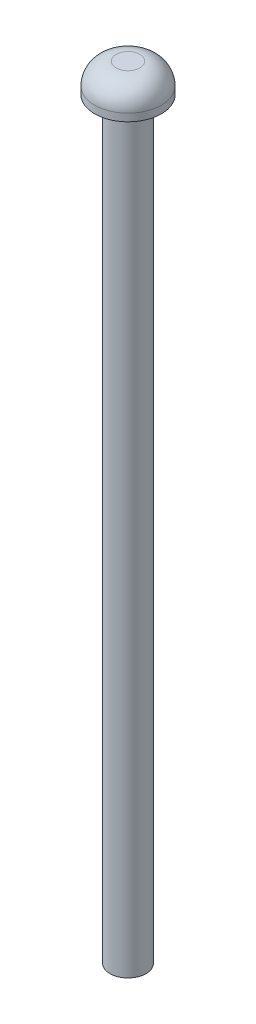
ISO-10303-21;
HEADER;
FILE_DESCRIPTION(('STEP AP214'),'2;1');
FILE_NAME('part.step','',(''),(''),'','','');
FILE_SCHEMA(('AUTOMOTIVE_DESIGN { 1 0 10303 214 1 1 1 1 }'));
ENDSEC;
DATA;
#1=APPLICATION_CONTEXT('core data for automotive mechanical design processes');
#2=APPLICATION_PROTOCOL_DEFINITION('international standard','automotive_design',2000,#1);
#3=PRODUCT_CONTEXT('',#1,'mechanical');
#4=PRODUCT('Part','Part','',(#3));
#5=PRODUCT_RELATED_PRODUCT_CATEGORY('part','',(#4));
#6=PRODUCT_DEFINITION_FORMATION('','',#4);
#7=PRODUCT_DEFINITION_CONTEXT('part definition',#1,'design');
#8=PRODUCT_DEFINITION('design','',#6,#7);
#9=PRODUCT_DEFINITION_SHAPE('','',#8);
#10=(LENGTH_UNIT() NAMED_UNIT(*) SI_UNIT(.MILLI.,.METRE.));
#11=(NAMED_UNIT(*) PLANE_ANGLE_UNIT() SI_UNIT($,.RADIAN.));
#12=(NAMED_UNIT(*) SI_UNIT($,.STERADIAN.) SOLID_ANGLE_UNIT());
#13=UNCERTAINTY_MEASURE_WITH_UNIT(LENGTH_MEASURE(1.E-05),#10,'distance_accuracy_value','');
#14=(GEOMETRIC_REPRESENTATION_CONTEXT(3) GLOBAL_UNCERTAINTY_ASSIGNED_CONTEXT((#13)) GLOBAL_UNIT_ASSIGNED_CONTEXT((#10,
#11,#12)) REPRESENTATION_CONTEXT('',''));
#15=CARTESIAN_POINT('',(0.,0.,0.));
#16=DIRECTION('',(0.,0.,1.));
#17=DIRECTION('',(1.,0.,0.));
#18=AXIS2_PLACEMENT_3D('',#15,#16,#17);
#19=CARTESIAN_POINT('',(0.,-70.,0.));
#20=DIRECTION('',(0.,1.,0.));
#21=DIRECTION('',(0.,0.,1.));
#22=AXIS2_PLACEMENT_3D('',#19,#20,#21);
#23=CYLINDRICAL_SURFACE('',#22,1.675);
#24=CARTESIAN_POINT('',(0.,-70.,0.));
#25=DIRECTION('',(0.,1.,0.));
#26=DIRECTION('',(0.,0.,1.));
#27=AXIS2_PLACEMENT_3D('',#24,#25,#26);
#28=CIRCLE('',#27,1.675);
#29=CARTESIAN_POINT('',(0.,-70.,1.675));
#30=VERTEX_POINT('',#29);
#31=EDGE_CURVE('E42',#30,#30,#28,.T.);
#32=ORIENTED_EDGE('',*,*,#31,.T.);
#33=EDGE_LOOP('',(#32));
#34=FACE_BOUND('',#33,.T.);
#35=CARTESIAN_POINT('',(0.,0.,0.));
#36=DIRECTION('',(0.,1.,0.));
#37=DIRECTION('',(0.,0.,1.));
#38=AXIS2_PLACEMENT_3D('',#35,#36,#37);
#39=CIRCLE('',#38,1.675);
#40=CARTESIAN_POINT('',(0.,0.,1.675));
#41=VERTEX_POINT('',#40);
#42=EDGE_CURVE('E46',#41,#41,#39,.T.);
#43=ORIENTED_EDGE('',*,*,#42,.F.);
#44=EDGE_LOOP('',(#43));
#45=FACE_BOUND('',#44,.T.);
#46=ADVANCED_FACE('F31',(#34,#45),#23,.T.);
#47=CARTESIAN_POINT('',(0.,-70.,0.));
#48=DIRECTION('',(0.,1.,0.));
#49=DIRECTION('',(0.,0.,1.));
#50=AXIS2_PLACEMENT_3D('',#47,#48,#49);
#51=PLANE('',#50);
#52=ORIENTED_EDGE('',*,*,#31,.F.);
#53=EDGE_LOOP('',(#52));
#54=FACE_BOUND('',#53,.T.);
#55=ADVANCED_FACE('F70',(#54),#51,.F.);
#56=CARTESIAN_POINT('',(0.,2.7,0.));
#57=DIRECTION('',(0.,-1.,0.));
#58=DIRECTION('',(0.,0.,-1.));
#59=AXIS2_PLACEMENT_3D('',#56,#57,#58);
#60=CYLINDRICAL_SURFACE('',#59,3.1);
#61=CARTESIAN_POINT('',(0.,0.699999999999998,0.));
#62=DIRECTION('',(0.,1.,0.));
#63=DIRECTION('',(0.,0.,1.));
#64=AXIS2_PLACEMENT_3D('',#61,#62,#63);
#65=CIRCLE('',#64,3.1);
#66=CARTESIAN_POINT('',(0.,0.699999999999998,-3.1));
#67=VERTEX_POINT('',#66);
#68=EDGE_CURVE('E10',#67,#67,#65,.F.);
#69=CARTESIAN_POINT('',(0.,0.,0.));
#70=DIRECTION('',(0.,1.,0.));
#71=DIRECTION('',(0.,0.,1.));
#72=AXIS2_PLACEMENT_3D('',#69,#70,#71);
#73=CIRCLE('',#72,3.1);
#74=CARTESIAN_POINT('',(0.,0.,-3.1));
#75=VERTEX_POINT('',#74);
#76=EDGE_CURVE('E50',#75,#75,#73,.T.);
#77=CARTESIAN_POINT('',(0.,0.699999999999998,-3.1));
#78=CARTESIAN_POINT('',(0.,0.692708333333331,-3.1));
#79=CARTESIAN_POINT('',(0.,0.685416666666665,-3.1));
#80=CARTESIAN_POINT('',(0.,0.670833333333331,-3.1));
#81=CARTESIAN_POINT('',(0.,0.663541666666665,-3.1));
#82=CARTESIAN_POINT('',(0.,0.648958333333331,-3.1));
#83=CARTESIAN_POINT('',(0.,0.641666666666665,-3.1));
#84=CARTESIAN_POINT('',(0.,0.627083333333331,-3.1));
#85=CARTESIAN_POINT('',(0.,0.619791666666665,-3.1));
#86=CARTESIAN_POINT('',(0.,0.605208333333331,-3.1));
#87=CARTESIAN_POINT('',(0.,0.597916666666665,-3.1));
#88=CARTESIAN_POINT('',(0.,0.583333333333331,-3.1));
#89=CARTESIAN_POINT('',(0.,0.576041666666665,-3.1));
#90=CARTESIAN_POINT('',(0.,0.561458333333332,-3.1));
#91=CARTESIAN_POINT('',(0.,0.554166666666665,-3.1));
#92=CARTESIAN_POINT('',(0.,0.539583333333332,-3.1));
#93=CARTESIAN_POINT('',(0.,0.532291666666665,-3.1));
#94=CARTESIAN_POINT('',(0.,0.517708333333332,-3.1));
#95=CARTESIAN_POINT('',(0.,0.510416666666665,-3.1));
#96=CARTESIAN_POINT('',(0.,0.495833333333332,-3.1));
#97=CARTESIAN_POINT('',(0.,0.488541666666665,-3.1));
#98=CARTESIAN_POINT('',(0.,0.473958333333332,-3.1));
#99=CARTESIAN_POINT('',(0.,0.466666666666665,-3.1));
#100=CARTESIAN_POINT('',(0.,0.452083333333332,-3.1));
#101=CARTESIAN_POINT('',(0.,0.444791666666665,-3.1));
#102=CARTESIAN_POINT('',(0.,0.430208333333332,-3.1));
#103=CARTESIAN_POINT('',(0.,0.422916666666665,-3.1));
#104=CARTESIAN_POINT('',(0.,0.408333333333332,-3.1));
#105=CARTESIAN_POINT('',(0.,0.401041666666665,-3.1));
#106=CARTESIAN_POINT('',(0.,0.386458333333332,-3.1));
#107=CARTESIAN_POINT('',(0.,0.379166666666665,-3.1));
#108=CARTESIAN_POINT('',(0.,0.364583333333332,-3.1));
#109=CARTESIAN_POINT('',(0.,0.357291666666665,-3.1));
#110=CARTESIAN_POINT('',(0.,0.342708333333332,-3.1));
#111=CARTESIAN_POINT('',(0.,0.335416666666666,-3.1));
#112=CARTESIAN_POINT('',(0.,0.320833333333332,-3.1));
#113=CARTESIAN_POINT('',(0.,0.313541666666666,-3.1));
#114=CARTESIAN_POINT('',(0.,0.298958333333332,-3.1));
#115=CARTESIAN_POINT('',(0.,0.291666666666666,-3.1));
#116=CARTESIAN_POINT('',(0.,0.277083333333332,-3.1));
#117=CARTESIAN_POINT('',(0.,0.269791666666666,-3.1));
#118=CARTESIAN_POINT('',(0.,0.255208333333332,-3.1));
#119=CARTESIAN_POINT('',(0.,0.247916666666666,-3.1));
#120=CARTESIAN_POINT('',(0.,0.233333333333332,-3.1));
#121=CARTESIAN_POINT('',(0.,0.226041666666666,-3.1));
#122=CARTESIAN_POINT('',(0.,0.211458333333332,-3.1));
#123=CARTESIAN_POINT('',(0.,0.204166666666666,-3.1));
#124=CARTESIAN_POINT('',(0.,0.189583333333333,-3.1));
#125=CARTESIAN_POINT('',(0.,0.182291666666666,-3.1));
#126=CARTESIAN_POINT('',(0.,0.167708333333333,-3.1));
#127=CARTESIAN_POINT('',(0.,0.160416666666666,-3.1));
#128=CARTESIAN_POINT('',(0.,0.145833333333332,-3.1));
#129=CARTESIAN_POINT('',(0.,0.138541666666666,-3.1));
#130=CARTESIAN_POINT('',(0.,0.123958333333332,-3.1));
#131=CARTESIAN_POINT('',(0.,0.116666666666666,-3.1));
#132=CARTESIAN_POINT('',(0.,0.102083333333333,-3.1));
#133=CARTESIAN_POINT('',(0.,0.0947916666666661,-3.1));
#134=CARTESIAN_POINT('',(0.,0.0802083333333327,-3.1));
#135=CARTESIAN_POINT('',(0.,0.072916666666666,-3.1));
#136=CARTESIAN_POINT('',(0.,0.0583333333333327,-3.1));
#137=CARTESIAN_POINT('',(0.,0.0510416666666661,-3.1));
#138=CARTESIAN_POINT('',(0.,0.0364583333333329,-3.1));
#139=CARTESIAN_POINT('',(0.,0.0291666666666663,-3.1));
#140=CARTESIAN_POINT('',(0.,0.014583333333333,-3.1));
#141=CARTESIAN_POINT('',(0.,0.00729166666666629,-3.1));
#142=CARTESIAN_POINT('',(0.,0.,-3.1));
#143=B_SPLINE_CURVE_WITH_KNOTS('',3,(#77,#78,#79,#80,#81,#82,#83,#84,#85,#86,#87,#88,#89,#90,
#91,#92,#93,#94,#95,#96,#97,#98,#99,#100,#101,#102,#103,#104,#105,#106,#107,#108,#109,#110,#111,
#112,#113,#114,#115,#116,#117,#118,#119,#120,#121,#122,#123,#124,#125,#126,#127,#128,#129,#130,
#131,#132,#133,#134,#135,#136,#137,#138,#139,#140,#141,#142),.UNSPECIFIED.,.F.,.F.,(4,2,2,2,2,2,
2,2,2,2,2,2,2,2,2,2,2,2,2,2,2,2,2,2,2,2,2,2,2,2,2,2,4),(0.,0.0218749999999998,0.04375,
0.0656249999999997,0.0874999999999999,0.109375,0.13125,0.153125,0.175,0.196875,
0.218749999999999,0.240625,0.262499999999999,0.284374999999999,0.306249999999999,
0.328124999999999,0.349999999999999,0.371874999999999,0.393749999999999,0.415624999999999,
0.437499999999999,0.459374999999999,0.481249999999999,0.503124999999999,0.524999999999999,
0.546874999999999,0.568749999999999,0.590624999999999,0.612499999999998,0.634374999999999,
0.656249999999998,0.678124999999998,0.699999999999998),.UNSPECIFIED.);
#144=EDGE_CURVE('BSEAM55',#67,#75,#143,.T.);
#145=ORIENTED_EDGE('',*,*,#68,.T.);
#146=ORIENTED_EDGE('',*,*,#76,.T.);
#147=ORIENTED_EDGE('',*,*,#144,.T.);
#148=ORIENTED_EDGE('',*,*,#144,.F.);
#149=EDGE_LOOP('',(#145,#147,#146,#148));
#150=FACE_BOUND('',#149,.T.);
#151=ADVANCED_FACE('F55',(#150),#60,.T.);
#152=CARTESIAN_POINT('',(0.,2.7,0.));
#153=DIRECTION('',(0.,1.,0.));
#154=DIRECTION('',(0.,0.,1.));
#155=AXIS2_PLACEMENT_3D('',#152,#153,#154);
#156=PLANE('',#155);
#157=CARTESIAN_POINT('',(0.,2.7,0.));
#158=DIRECTION('',(0.,1.,0.));
#159=DIRECTION('',(0.,0.,1.));
#160=AXIS2_PLACEMENT_3D('',#157,#158,#159);
#161=CIRCLE('',#160,1.1);
#162=CARTESIAN_POINT('',(0.,2.7,1.1));
#163=VERTEX_POINT('',#162);
#164=EDGE_CURVE('E38',#163,#163,#161,.T.);
#165=ORIENTED_EDGE('',*,*,#164,.T.);
#166=EDGE_LOOP('',(#165));
#167=FACE_BOUND('',#166,.T.);
#168=ADVANCED_FACE('F59',(#167),#156,.T.);
#169=CARTESIAN_POINT('',(0.,0.,0.));
#170=DIRECTION('',(0.,1.,0.));
#171=DIRECTION('',(0.,0.,1.));
#172=AXIS2_PLACEMENT_3D('',#169,#170,#171);
#173=PLANE('',#172);
#174=ORIENTED_EDGE('',*,*,#42,.T.);
#175=EDGE_LOOP('',(#174));
#176=FACE_BOUND('',#175,.T.);
#177=ORIENTED_EDGE('',*,*,#76,.F.);
#178=EDGE_LOOP('',(#177));
#179=FACE_BOUND('',#178,.T.);
#180=ADVANCED_FACE('F57',(#176,#179),#173,.F.);
#181=CARTESIAN_POINT('',(0.,0.7,0.));
#182=DIRECTION('',(0.,1.,0.));
#183=DIRECTION('',(0.,0.,1.));
#184=AXIS2_PLACEMENT_3D('',#181,#182,#183);
#185=DEGENERATE_TOROIDAL_SURFACE('',#184,1.1,2.,.T.);
#186=ORIENTED_EDGE('',*,*,#68,.F.);
#187=EDGE_LOOP('',(#186));
#188=FACE_BOUND('',#187,.T.);
#189=ORIENTED_EDGE('',*,*,#164,.F.);
#190=EDGE_LOOP('',(#189));
#191=FACE_BOUND('',#190,.T.);
#192=ADVANCED_FACE('F33',(#188,#191),#185,.T.);
#193=CLOSED_SHELL('',(#46,#55,#151,#168,#180,#192));
#194=MANIFOLD_SOLID_BREP('B2',#193);
#195=ADVANCED_BREP_SHAPE_REPRESENTATION('',(#18,#194),#14);
#196=SHAPE_DEFINITION_REPRESENTATION(#9,#195);
ENDSEC;
END-ISO-10303-21;
